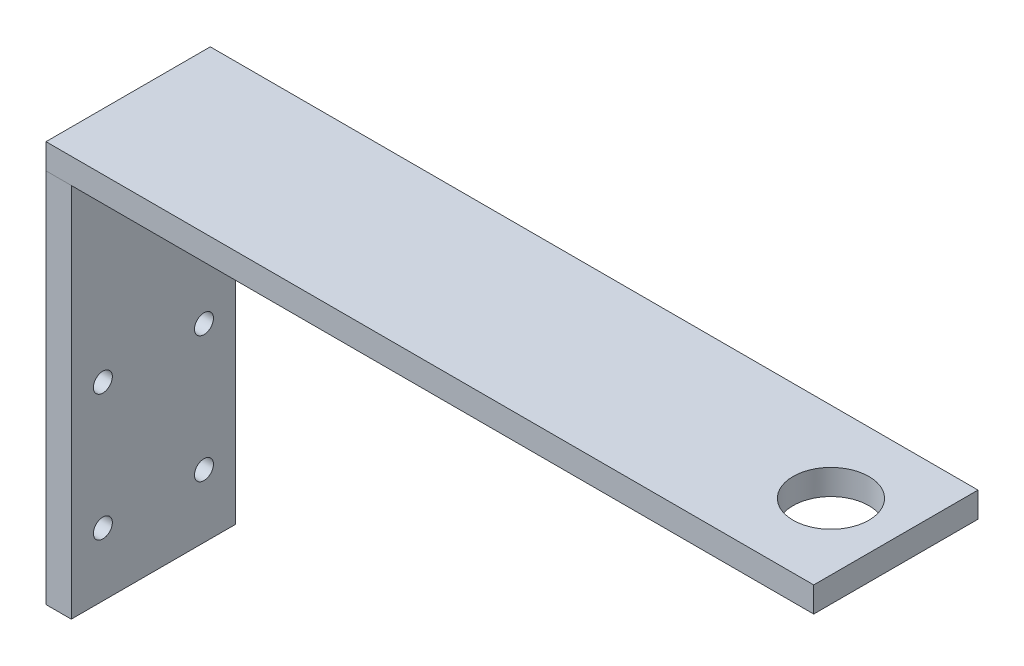
ISO-10303-21;
HEADER;
FILE_DESCRIPTION(('STEP AP214'),'2;1');
FILE_NAME('part.step','',(''),(''),'','','');
FILE_SCHEMA(('AUTOMOTIVE_DESIGN { 1 0 10303 214 1 1 1 1 }'));
ENDSEC;
DATA;
#1=APPLICATION_CONTEXT('core data for automotive mechanical design processes');
#2=APPLICATION_PROTOCOL_DEFINITION('international standard','automotive_design',2000,#1);
#3=PRODUCT_CONTEXT('',#1,'mechanical');
#4=PRODUCT('Part','Part','',(#3));
#5=PRODUCT_RELATED_PRODUCT_CATEGORY('part','',(#4));
#6=PRODUCT_DEFINITION_FORMATION('','',#4);
#7=PRODUCT_DEFINITION_CONTEXT('part definition',#1,'design');
#8=PRODUCT_DEFINITION('design','',#6,#7);
#9=PRODUCT_DEFINITION_SHAPE('','',#8);
#10=(LENGTH_UNIT() NAMED_UNIT(*) SI_UNIT(.MILLI.,.METRE.));
#11=(NAMED_UNIT(*) PLANE_ANGLE_UNIT() SI_UNIT($,.RADIAN.));
#12=(NAMED_UNIT(*) SI_UNIT($,.STERADIAN.) SOLID_ANGLE_UNIT());
#13=UNCERTAINTY_MEASURE_WITH_UNIT(LENGTH_MEASURE(1.E-05),#10,'distance_accuracy_value','');
#14=(GEOMETRIC_REPRESENTATION_CONTEXT(3) GLOBAL_UNCERTAINTY_ASSIGNED_CONTEXT((#13)) GLOBAL_UNIT_ASSIGNED_CONTEXT((#10,
#11,#12)) REPRESENTATION_CONTEXT('',''));
#15=CARTESIAN_POINT('',(0.,0.,0.));
#16=DIRECTION('',(0.,0.,1.));
#17=DIRECTION('',(1.,0.,0.));
#18=AXIS2_PLACEMENT_3D('',#15,#16,#17);
#19=CARTESIAN_POINT('',(0.,99.4499999999999,0.));
#20=DIRECTION('',(0.,-1.,0.));
#21=DIRECTION('',(0.,0.,-1.));
#22=AXIS2_PLACEMENT_3D('',#19,#20,#21);
#23=PLANE('',#22);
#24=DIRECTION('',(0.,0.,1.));
#25=VECTOR('',#24,1.);
#26=CARTESIAN_POINT('',(71.,99.4499999999999,-13.));
#27=LINE('',#26,#25);
#28=CARTESIAN_POINT('',(71.,99.4499999999999,-13.));
#29=VERTEX_POINT('',#28);
#30=CARTESIAN_POINT('',(71.,99.4499999999999,13.));
#31=VERTEX_POINT('',#30);
#32=EDGE_CURVE('E99',#29,#31,#27,.T.);
#33=ORIENTED_EDGE('',*,*,#32,.F.);
#34=DIRECTION('',(-1.,0.,0.));
#35=VECTOR('',#34,1.);
#36=CARTESIAN_POINT('',(220.805892875932,99.4499999999999,-13.));
#37=LINE('',#36,#35);
#38=CARTESIAN_POINT('',(192.5,99.4499999999999,-13.));
#39=VERTEX_POINT('',#38);
#40=EDGE_CURVE('E90',#39,#29,#37,.T.);
#41=ORIENTED_EDGE('',*,*,#40,.F.);
#42=DIRECTION('',(0.,0.,-1.));
#43=VECTOR('',#42,1.);
#44=CARTESIAN_POINT('',(192.5,99.4499999999999,13.));
#45=LINE('',#44,#43);
#46=CARTESIAN_POINT('',(192.5,99.4499999999999,13.));
#47=VERTEX_POINT('',#46);
#48=EDGE_CURVE('E102',#47,#39,#45,.T.);
#49=ORIENTED_EDGE('',*,*,#48,.F.);
#50=DIRECTION('',(-1.,0.,0.));
#51=VECTOR('',#50,1.);
#52=CARTESIAN_POINT('',(220.805892875932,99.4499999999999,13.));
#53=LINE('',#52,#51);
#54=EDGE_CURVE('E97',#47,#31,#53,.T.);
#55=ORIENTED_EDGE('',*,*,#54,.T.);
#56=EDGE_LOOP('',(#33,#41,#49,#55));
#57=FACE_BOUND('',#56,.T.);
#58=CARTESIAN_POINT('',(182.,99.4499999999999,-0.230000000000029));
#59=DIRECTION('',(0.,-1.,0.));
#60=DIRECTION('',(0.,0.,-1.));
#61=AXIS2_PLACEMENT_3D('',#58,#59,#60);
#62=CIRCLE('',#61,6.00000000000002);
#63=CARTESIAN_POINT('',(182.,99.4499999999999,-6.23000000000005));
#64=VERTEX_POINT('',#63);
#65=EDGE_CURVE('E96',#64,#64,#62,.T.);
#66=ORIENTED_EDGE('',*,*,#65,.F.);
#67=EDGE_LOOP('',(#66));
#68=FACE_BOUND('',#67,.T.);
#69=ADVANCED_FACE('F47',(#57,#68),#23,.T.);
#70=CARTESIAN_POINT('',(220.805892875932,103.45,13.));
#71=DIRECTION('',(0.,1.,0.));
#72=DIRECTION('',(0.,0.,1.));
#73=AXIS2_PLACEMENT_3D('',#70,#71,#72);
#74=PLANE('',#73);
#75=CARTESIAN_POINT('',(182.,103.45,-0.230000000000029));
#76=DIRECTION('',(0.,1.,0.));
#77=DIRECTION('',(0.,0.,1.));
#78=AXIS2_PLACEMENT_3D('',#75,#76,#77);
#79=CIRCLE('',#78,6.00000000000002);
#80=CARTESIAN_POINT('',(182.,103.45,5.76999999999999));
#81=VERTEX_POINT('',#80);
#82=EDGE_CURVE('E104',#81,#81,#79,.F.);
#83=ORIENTED_EDGE('',*,*,#82,.T.);
#84=EDGE_LOOP('',(#83));
#85=FACE_BOUND('',#84,.T.);
#86=DIRECTION('',(0.,0.,1.));
#87=VECTOR('',#86,1.);
#88=CARTESIAN_POINT('',(192.5,103.45,13.));
#89=LINE('',#88,#87);
#90=CARTESIAN_POINT('',(192.5,103.45,-13.));
#91=VERTEX_POINT('',#90);
#92=CARTESIAN_POINT('',(192.5,103.45,13.));
#93=VERTEX_POINT('',#92);
#94=EDGE_CURVE('E113',#91,#93,#89,.T.);
#95=ORIENTED_EDGE('',*,*,#94,.F.);
#96=DIRECTION('',(-1.,0.,0.));
#97=VECTOR('',#96,1.);
#98=CARTESIAN_POINT('',(220.805892875932,103.45,-13.));
#99=LINE('',#98,#97);
#100=CARTESIAN_POINT('',(71.,103.45,-13.));
#101=VERTEX_POINT('',#100);
#102=EDGE_CURVE('E112',#91,#101,#99,.T.);
#103=ORIENTED_EDGE('',*,*,#102,.T.);
#104=DIRECTION('',(0.,0.,1.));
#105=VECTOR('',#104,1.);
#106=CARTESIAN_POINT('',(71.,103.45,-13.));
#107=LINE('',#106,#105);
#108=CARTESIAN_POINT('',(71.,103.45,13.));
#109=VERTEX_POINT('',#108);
#110=EDGE_CURVE('E13',#101,#109,#107,.T.);
#111=ORIENTED_EDGE('',*,*,#110,.T.);
#112=DIRECTION('',(-1.,0.,0.));
#113=VECTOR('',#112,1.);
#114=CARTESIAN_POINT('',(220.805892875932,103.45,13.));
#115=LINE('',#114,#113);
#116=EDGE_CURVE('E117',#93,#109,#115,.T.);
#117=ORIENTED_EDGE('',*,*,#116,.F.);
#118=EDGE_LOOP('',(#95,#103,#111,#117));
#119=FACE_BOUND('',#118,.T.);
#120=ADVANCED_FACE('F128',(#85,#119),#74,.T.);
#121=CARTESIAN_POINT('',(220.805892875932,103.45,13.));
#122=DIRECTION('',(0.,0.,1.));
#123=DIRECTION('',(0.,-1.,0.));
#124=AXIS2_PLACEMENT_3D('',#121,#122,#123);
#125=PLANE('',#124);
#126=DIRECTION('',(0.,1.,0.));
#127=VECTOR('',#126,1.);
#128=CARTESIAN_POINT('',(71.,-26.3058928759318,13.));
#129=LINE('',#128,#127);
#130=EDGE_CURVE('E70',#31,#109,#129,.T.);
#131=ORIENTED_EDGE('',*,*,#130,.F.);
#132=ORIENTED_EDGE('',*,*,#54,.F.);
#133=DIRECTION('',(0.,-1.,0.));
#134=VECTOR('',#133,1.);
#135=CARTESIAN_POINT('',(192.5,103.45,13.));
#136=LINE('',#135,#134);
#137=EDGE_CURVE('E110',#93,#47,#136,.T.);
#138=ORIENTED_EDGE('',*,*,#137,.F.);
#139=ORIENTED_EDGE('',*,*,#116,.T.);
#140=EDGE_LOOP('',(#131,#132,#138,#139));
#141=FACE_BOUND('',#140,.T.);
#142=ADVANCED_FACE('F126',(#141),#125,.T.);
#143=CARTESIAN_POINT('',(220.805892875932,103.45,-13.));
#144=DIRECTION('',(0.,0.,-1.));
#145=DIRECTION('',(0.,1.,0.));
#146=AXIS2_PLACEMENT_3D('',#143,#144,#145);
#147=PLANE('',#146);
#148=ORIENTED_EDGE('',*,*,#40,.T.);
#149=DIRECTION('',(0.,1.,0.));
#150=VECTOR('',#149,1.);
#151=CARTESIAN_POINT('',(71.,-26.3058928759318,-13.));
#152=LINE('',#151,#150);
#153=EDGE_CURVE('E51',#29,#101,#152,.T.);
#154=ORIENTED_EDGE('',*,*,#153,.T.);
#155=ORIENTED_EDGE('',*,*,#102,.F.);
#156=DIRECTION('',(0.,1.,0.));
#157=VECTOR('',#156,1.);
#158=CARTESIAN_POINT('',(192.5,103.45,-13.));
#159=LINE('',#158,#157);
#160=EDGE_CURVE('E93',#39,#91,#159,.T.);
#161=ORIENTED_EDGE('',*,*,#160,.F.);
#162=EDGE_LOOP('',(#148,#154,#155,#161));
#163=FACE_BOUND('',#162,.T.);
#164=ADVANCED_FACE('F92',(#163),#147,.T.);
#165=CARTESIAN_POINT('',(71.,-26.3058928759318,-13.));
#166=DIRECTION('',(-1.,0.,0.));
#167=DIRECTION('',(0.,0.,1.));
#168=AXIS2_PLACEMENT_3D('',#165,#166,#167);
#169=PLANE('',#168);
#170=ORIENTED_EDGE('',*,*,#153,.F.);
#171=ORIENTED_EDGE('',*,*,#32,.T.);
#172=ORIENTED_EDGE('',*,*,#130,.T.);
#173=ORIENTED_EDGE('',*,*,#110,.F.);
#174=EDGE_LOOP('',(#170,#171,#172,#173));
#175=FACE_BOUND('',#174,.T.);
#176=ADVANCED_FACE('F49',(#175),#169,.T.);
#177=CARTESIAN_POINT('',(182.,103.451,-0.230000000000029));
#178=DIRECTION('',(0.,-1.,0.));
#179=DIRECTION('',(0.,0.,-1.));
#180=AXIS2_PLACEMENT_3D('',#177,#178,#179);
#181=CYLINDRICAL_SURFACE('',#180,6.00000000000002);
#182=ORIENTED_EDGE('',*,*,#82,.F.);
#183=EDGE_LOOP('',(#182));
#184=FACE_BOUND('',#183,.T.);
#185=ORIENTED_EDGE('',*,*,#65,.T.);
#186=EDGE_LOOP('',(#185));
#187=FACE_BOUND('',#186,.T.);
#188=ADVANCED_FACE('F141',(#184,#187),#181,.F.);
#189=CARTESIAN_POINT('',(192.5,105.1,9.99999999999998));
#190=DIRECTION('',(-1.,0.,0.));
#191=DIRECTION('',(0.,1.,0.));
#192=AXIS2_PLACEMENT_3D('',#189,#190,#191);
#193=PLANE('',#192);
#194=ORIENTED_EDGE('',*,*,#160,.T.);
#195=ORIENTED_EDGE('',*,*,#94,.T.);
#196=ORIENTED_EDGE('',*,*,#137,.T.);
#197=ORIENTED_EDGE('',*,*,#48,.T.);
#198=EDGE_LOOP('',(#194,#195,#196,#197));
#199=FACE_BOUND('',#198,.T.);
#200=ADVANCED_FACE('F121',(#199),#193,.F.);
#201=CLOSED_SHELL('',(#69,#120,#142,#164,#176,#188,#200));
#202=MANIFOLD_SOLID_BREP('B2',#201);
#203=CARTESIAN_POINT('',(0.,99.4499999999999,0.));
#204=DIRECTION('',(0.,-1.,0.));
#205=DIRECTION('',(0.,0.,-1.));
#206=AXIS2_PLACEMENT_3D('',#203,#204,#205);
#207=PLANE('',#206);
#208=DIRECTION('',(0.,0.,1.));
#209=VECTOR('',#208,1.);
#210=CARTESIAN_POINT('',(75.,99.4499999999999,13.));
#211=LINE('',#210,#209);
#212=CARTESIAN_POINT('',(75.,99.4499999999999,-13.));
#213=VERTEX_POINT('',#212);
#214=CARTESIAN_POINT('',(75.,99.4499999999999,13.));
#215=VERTEX_POINT('',#214);
#216=EDGE_CURVE('E264',#213,#215,#211,.T.);
#217=ORIENTED_EDGE('',*,*,#216,.F.);
#218=DIRECTION('',(-1.,0.,0.));
#219=VECTOR('',#218,1.);
#220=CARTESIAN_POINT('',(220.805892875932,99.4499999999999,-13.));
#221=LINE('',#220,#219);
#222=CARTESIAN_POINT('',(71.,99.4499999999999,-13.));
#223=VERTEX_POINT('',#222);
#224=EDGE_CURVE('E207',#213,#223,#221,.T.);
#225=ORIENTED_EDGE('',*,*,#224,.T.);
#226=DIRECTION('',(0.,0.,1.));
#227=VECTOR('',#226,1.);
#228=CARTESIAN_POINT('',(71.,99.4499999999999,-13.));
#229=LINE('',#228,#227);
#230=CARTESIAN_POINT('',(71.,99.4499999999999,13.));
#231=VERTEX_POINT('',#230);
#232=EDGE_CURVE('E45',#223,#231,#229,.T.);
#233=ORIENTED_EDGE('',*,*,#232,.T.);
#234=DIRECTION('',(1.,0.,0.));
#235=VECTOR('',#234,1.);
#236=CARTESIAN_POINT('',(220.805892875932,99.4499999999999,13.));
#237=LINE('',#236,#235);
#238=EDGE_CURVE('E212',#231,#215,#237,.T.);
#239=ORIENTED_EDGE('',*,*,#238,.T.);
#240=EDGE_LOOP('',(#217,#225,#233,#239));
#241=FACE_BOUND('',#240,.T.);
#242=ADVANCED_FACE('F204',(#241),#207,.F.);
#243=CARTESIAN_POINT('',(192.501,70.,-7.99999999999998));
#244=DIRECTION('',(-1.,0.,0.));
#245=DIRECTION('',(0.,0.,1.));
#246=AXIS2_PLACEMENT_3D('',#243,#244,#245);
#247=CYLINDRICAL_SURFACE('',#246,1.5);
#248=CARTESIAN_POINT('',(75.,70.,-7.99999999999998));
#249=DIRECTION('',(1.,0.,0.));
#250=DIRECTION('',(0.,0.,-1.));
#251=AXIS2_PLACEMENT_3D('',#248,#249,#250);
#252=CIRCLE('',#251,1.5);
#253=CARTESIAN_POINT('',(75.,70.,-9.49999999999998));
#254=VERTEX_POINT('',#253);
#255=EDGE_CURVE('E278',#254,#254,#252,.F.);
#256=ORIENTED_EDGE('',*,*,#255,.F.);
#257=EDGE_LOOP('',(#256));
#258=FACE_BOUND('',#257,.T.);
#259=CARTESIAN_POINT('',(71.,70.,-7.99999999999998));
#260=DIRECTION('',(-1.,0.,0.));
#261=DIRECTION('',(0.,0.,1.));
#262=AXIS2_PLACEMENT_3D('',#259,#260,#261);
#263=CIRCLE('',#262,1.5);
#264=CARTESIAN_POINT('',(71.,70.,-6.49999999999998));
#265=VERTEX_POINT('',#264);
#266=EDGE_CURVE('E276',#265,#265,#263,.T.);
#267=ORIENTED_EDGE('',*,*,#266,.T.);
#268=EDGE_LOOP('',(#267));
#269=FACE_BOUND('',#268,.T.);
#270=ADVANCED_FACE('F305',(#258,#269),#247,.F.);
#271=CARTESIAN_POINT('',(192.501,50.,7.99999999999997));
#272=DIRECTION('',(-1.,0.,0.));
#273=DIRECTION('',(0.,0.,1.));
#274=AXIS2_PLACEMENT_3D('',#271,#272,#273);
#275=CYLINDRICAL_SURFACE('',#274,1.5);
#276=CARTESIAN_POINT('',(75.,50.,7.99999999999997));
#277=DIRECTION('',(1.,0.,0.));
#278=DIRECTION('',(0.,0.,-1.));
#279=AXIS2_PLACEMENT_3D('',#276,#277,#278);
#280=CIRCLE('',#279,1.5);
#281=CARTESIAN_POINT('',(75.,50.,6.49999999999997));
#282=VERTEX_POINT('',#281);
#283=EDGE_CURVE('E331',#282,#282,#280,.F.);
#284=ORIENTED_EDGE('',*,*,#283,.F.);
#285=EDGE_LOOP('',(#284));
#286=FACE_BOUND('',#285,.T.);
#287=CARTESIAN_POINT('',(71.,50.,7.99999999999997));
#288=DIRECTION('',(-1.,0.,0.));
#289=DIRECTION('',(0.,0.,1.));
#290=AXIS2_PLACEMENT_3D('',#287,#288,#289);
#291=CIRCLE('',#290,1.5);
#292=CARTESIAN_POINT('',(71.,50.,9.49999999999997));
#293=VERTEX_POINT('',#292);
#294=EDGE_CURVE('E334',#293,#293,#291,.T.);
#295=ORIENTED_EDGE('',*,*,#294,.T.);
#296=EDGE_LOOP('',(#295));
#297=FACE_BOUND('',#296,.T.);
#298=ADVANCED_FACE('F309',(#286,#297),#275,.F.);
#299=CARTESIAN_POINT('',(192.501,50.,-7.99999999999998));
#300=DIRECTION('',(-1.,0.,0.));
#301=DIRECTION('',(0.,0.,1.));
#302=AXIS2_PLACEMENT_3D('',#299,#300,#301);
#303=CYLINDRICAL_SURFACE('',#302,1.5);
#304=CARTESIAN_POINT('',(75.,50.,-7.99999999999998));
#305=DIRECTION('',(1.,0.,0.));
#306=DIRECTION('',(0.,0.,-1.));
#307=AXIS2_PLACEMENT_3D('',#304,#305,#306);
#308=CIRCLE('',#307,1.5);
#309=CARTESIAN_POINT('',(75.,50.,-9.49999999999998));
#310=VERTEX_POINT('',#309);
#311=EDGE_CURVE('E286',#310,#310,#308,.F.);
#312=ORIENTED_EDGE('',*,*,#311,.F.);
#313=EDGE_LOOP('',(#312));
#314=FACE_BOUND('',#313,.T.);
#315=CARTESIAN_POINT('',(71.,50.,-7.99999999999998));
#316=DIRECTION('',(-1.,0.,0.));
#317=DIRECTION('',(0.,0.,1.));
#318=AXIS2_PLACEMENT_3D('',#315,#316,#317);
#319=CIRCLE('',#318,1.5);
#320=CARTESIAN_POINT('',(71.,50.,-6.49999999999998));
#321=VERTEX_POINT('',#320);
#322=EDGE_CURVE('E338',#321,#321,#319,.T.);
#323=ORIENTED_EDGE('',*,*,#322,.T.);
#324=EDGE_LOOP('',(#323));
#325=FACE_BOUND('',#324,.T.);
#326=ADVANCED_FACE('F300',(#314,#325),#303,.F.);
#327=CARTESIAN_POINT('',(192.501,70.,7.99999999999997));
#328=DIRECTION('',(-1.,0.,0.));
#329=DIRECTION('',(0.,0.,1.));
#330=AXIS2_PLACEMENT_3D('',#327,#328,#329);
#331=CYLINDRICAL_SURFACE('',#330,1.5);
#332=CARTESIAN_POINT('',(75.,70.,7.99999999999997));
#333=DIRECTION('',(1.,0.,0.));
#334=DIRECTION('',(0.,0.,-1.));
#335=AXIS2_PLACEMENT_3D('',#332,#333,#334);
#336=CIRCLE('',#335,1.5);
#337=CARTESIAN_POINT('',(75.,70.,6.49999999999997));
#338=VERTEX_POINT('',#337);
#339=EDGE_CURVE('E343',#338,#338,#336,.F.);
#340=ORIENTED_EDGE('',*,*,#339,.F.);
#341=EDGE_LOOP('',(#340));
#342=FACE_BOUND('',#341,.T.);
#343=CARTESIAN_POINT('',(71.,70.,7.99999999999997));
#344=DIRECTION('',(-1.,0.,0.));
#345=DIRECTION('',(0.,0.,1.));
#346=AXIS2_PLACEMENT_3D('',#343,#344,#345);
#347=CIRCLE('',#346,1.5);
#348=CARTESIAN_POINT('',(71.,70.,9.49999999999997));
#349=VERTEX_POINT('',#348);
#350=EDGE_CURVE('E283',#349,#349,#347,.T.);
#351=ORIENTED_EDGE('',*,*,#350,.T.);
#352=EDGE_LOOP('',(#351));
#353=FACE_BOUND('',#352,.T.);
#354=ADVANCED_FACE('F293',(#342,#353),#331,.F.);
#355=CARTESIAN_POINT('',(220.805892875932,103.45,13.));
#356=DIRECTION('',(0.,0.,1.));
#357=DIRECTION('',(0.,-1.,0.));
#358=AXIS2_PLACEMENT_3D('',#355,#356,#357);
#359=PLANE('',#358);
#360=ORIENTED_EDGE('',*,*,#238,.F.);
#361=DIRECTION('',(0.,1.,0.));
#362=VECTOR('',#361,1.);
#363=CARTESIAN_POINT('',(71.,-26.3058928759318,13.));
#364=LINE('',#363,#362);
#365=CARTESIAN_POINT('',(71.,40.,13.));
#366=VERTEX_POINT('',#365);
#367=EDGE_CURVE('E258',#366,#231,#364,.T.);
#368=ORIENTED_EDGE('',*,*,#367,.F.);
#369=DIRECTION('',(-1.,0.,0.));
#370=VECTOR('',#369,1.);
#371=CARTESIAN_POINT('',(75.,40.,13.));
#372=LINE('',#371,#370);
#373=CARTESIAN_POINT('',(75.,40.,13.));
#374=VERTEX_POINT('',#373);
#375=EDGE_CURVE('E250',#374,#366,#372,.T.);
#376=ORIENTED_EDGE('',*,*,#375,.F.);
#377=DIRECTION('',(0.,1.,0.));
#378=VECTOR('',#377,1.);
#379=CARTESIAN_POINT('',(75.,-26.3058928759318,13.));
#380=LINE('',#379,#378);
#381=EDGE_CURVE('E251',#374,#215,#380,.T.);
#382=ORIENTED_EDGE('',*,*,#381,.T.);
#383=EDGE_LOOP('',(#360,#368,#376,#382));
#384=FACE_BOUND('',#383,.T.);
#385=ADVANCED_FACE('F291',(#384),#359,.T.);
#386=CARTESIAN_POINT('',(0.,40.,0.));
#387=DIRECTION('',(0.,1.,0.));
#388=DIRECTION('',(0.,0.,1.));
#389=AXIS2_PLACEMENT_3D('',#386,#387,#388);
#390=PLANE('',#389);
#391=DIRECTION('',(0.,0.,1.));
#392=VECTOR('',#391,1.);
#393=CARTESIAN_POINT('',(75.,40.,-13.));
#394=LINE('',#393,#392);
#395=CARTESIAN_POINT('',(75.,40.,-13.));
#396=VERTEX_POINT('',#395);
#397=EDGE_CURVE('E265',#396,#374,#394,.T.);
#398=ORIENTED_EDGE('',*,*,#397,.T.);
#399=ORIENTED_EDGE('',*,*,#375,.T.);
#400=DIRECTION('',(0.,0.,-1.));
#401=VECTOR('',#400,1.);
#402=CARTESIAN_POINT('',(71.,40.,-13.));
#403=LINE('',#402,#401);
#404=CARTESIAN_POINT('',(71.,40.,-13.));
#405=VERTEX_POINT('',#404);
#406=EDGE_CURVE('E244',#366,#405,#403,.T.);
#407=ORIENTED_EDGE('',*,*,#406,.T.);
#408=DIRECTION('',(1.,0.,0.));
#409=VECTOR('',#408,1.);
#410=CARTESIAN_POINT('',(75.,40.,-13.));
#411=LINE('',#410,#409);
#412=EDGE_CURVE('E247',#405,#396,#411,.T.);
#413=ORIENTED_EDGE('',*,*,#412,.T.);
#414=EDGE_LOOP('',(#398,#399,#407,#413));
#415=FACE_BOUND('',#414,.T.);
#416=ADVANCED_FACE('F245',(#415),#390,.F.);
#417=CARTESIAN_POINT('',(220.805892875932,103.45,-13.));
#418=DIRECTION('',(0.,0.,-1.));
#419=DIRECTION('',(0.,1.,0.));
#420=AXIS2_PLACEMENT_3D('',#417,#418,#419);
#421=PLANE('',#420);
#422=ORIENTED_EDGE('',*,*,#224,.F.);
#423=DIRECTION('',(0.,1.,0.));
#424=VECTOR('',#423,1.);
#425=CARTESIAN_POINT('',(75.,-26.3058928759318,-13.));
#426=LINE('',#425,#424);
#427=EDGE_CURVE('E259',#396,#213,#426,.T.);
#428=ORIENTED_EDGE('',*,*,#427,.F.);
#429=ORIENTED_EDGE('',*,*,#412,.F.);
#430=DIRECTION('',(0.,1.,0.));
#431=VECTOR('',#430,1.);
#432=CARTESIAN_POINT('',(71.,-26.3058928759318,-13.));
#433=LINE('',#432,#431);
#434=EDGE_CURVE('E254',#405,#223,#433,.T.);
#435=ORIENTED_EDGE('',*,*,#434,.T.);
#436=EDGE_LOOP('',(#422,#428,#429,#435));
#437=FACE_BOUND('',#436,.T.);
#438=ADVANCED_FACE('F262',(#437),#421,.T.);
#439=CARTESIAN_POINT('',(71.,-26.3058928759318,-13.));
#440=DIRECTION('',(-1.,0.,0.));
#441=DIRECTION('',(0.,0.,1.));
#442=AXIS2_PLACEMENT_3D('',#439,#440,#441);
#443=PLANE('',#442);
#444=ORIENTED_EDGE('',*,*,#232,.F.);
#445=ORIENTED_EDGE('',*,*,#434,.F.);
#446=ORIENTED_EDGE('',*,*,#406,.F.);
#447=ORIENTED_EDGE('',*,*,#367,.T.);
#448=EDGE_LOOP('',(#444,#445,#446,#447));
#449=FACE_BOUND('',#448,.T.);
#450=ORIENTED_EDGE('',*,*,#350,.F.);
#451=EDGE_LOOP('',(#450));
#452=FACE_BOUND('',#451,.T.);
#453=ORIENTED_EDGE('',*,*,#322,.F.);
#454=EDGE_LOOP('',(#453));
#455=FACE_BOUND('',#454,.T.);
#456=ORIENTED_EDGE('',*,*,#294,.F.);
#457=EDGE_LOOP('',(#456));
#458=FACE_BOUND('',#457,.T.);
#459=ORIENTED_EDGE('',*,*,#266,.F.);
#460=EDGE_LOOP('',(#459));
#461=FACE_BOUND('',#460,.T.);
#462=ADVANCED_FACE('F255',(#449,#452,#455,#458,#461),#443,.T.);
#463=CARTESIAN_POINT('',(75.,-26.3058928759318,-13.));
#464=DIRECTION('',(1.,0.,0.));
#465=DIRECTION('',(0.,0.,-1.));
#466=AXIS2_PLACEMENT_3D('',#463,#464,#465);
#467=PLANE('',#466);
#468=ORIENTED_EDGE('',*,*,#339,.T.);
#469=EDGE_LOOP('',(#468));
#470=FACE_BOUND('',#469,.T.);
#471=ORIENTED_EDGE('',*,*,#311,.T.);
#472=EDGE_LOOP('',(#471));
#473=FACE_BOUND('',#472,.T.);
#474=ORIENTED_EDGE('',*,*,#283,.T.);
#475=EDGE_LOOP('',(#474));
#476=FACE_BOUND('',#475,.T.);
#477=ORIENTED_EDGE('',*,*,#255,.T.);
#478=EDGE_LOOP('',(#477));
#479=FACE_BOUND('',#478,.T.);
#480=ORIENTED_EDGE('',*,*,#427,.T.);
#481=ORIENTED_EDGE('',*,*,#216,.T.);
#482=ORIENTED_EDGE('',*,*,#381,.F.);
#483=ORIENTED_EDGE('',*,*,#397,.F.);
#484=EDGE_LOOP('',(#480,#481,#482,#483));
#485=FACE_BOUND('',#484,.T.);
#486=ADVANCED_FACE('F275',(#470,#473,#476,#479,#485),#467,.T.);
#487=CLOSED_SHELL('',(#242,#270,#298,#326,#354,#385,#416,#438,#462,#486));
#488=MANIFOLD_SOLID_BREP('B7',#487);
#489=ADVANCED_BREP_SHAPE_REPRESENTATION('',(#18,#202,#488),#14);
#490=SHAPE_DEFINITION_REPRESENTATION(#9,#489);
ENDSEC;
END-ISO-10303-21;
